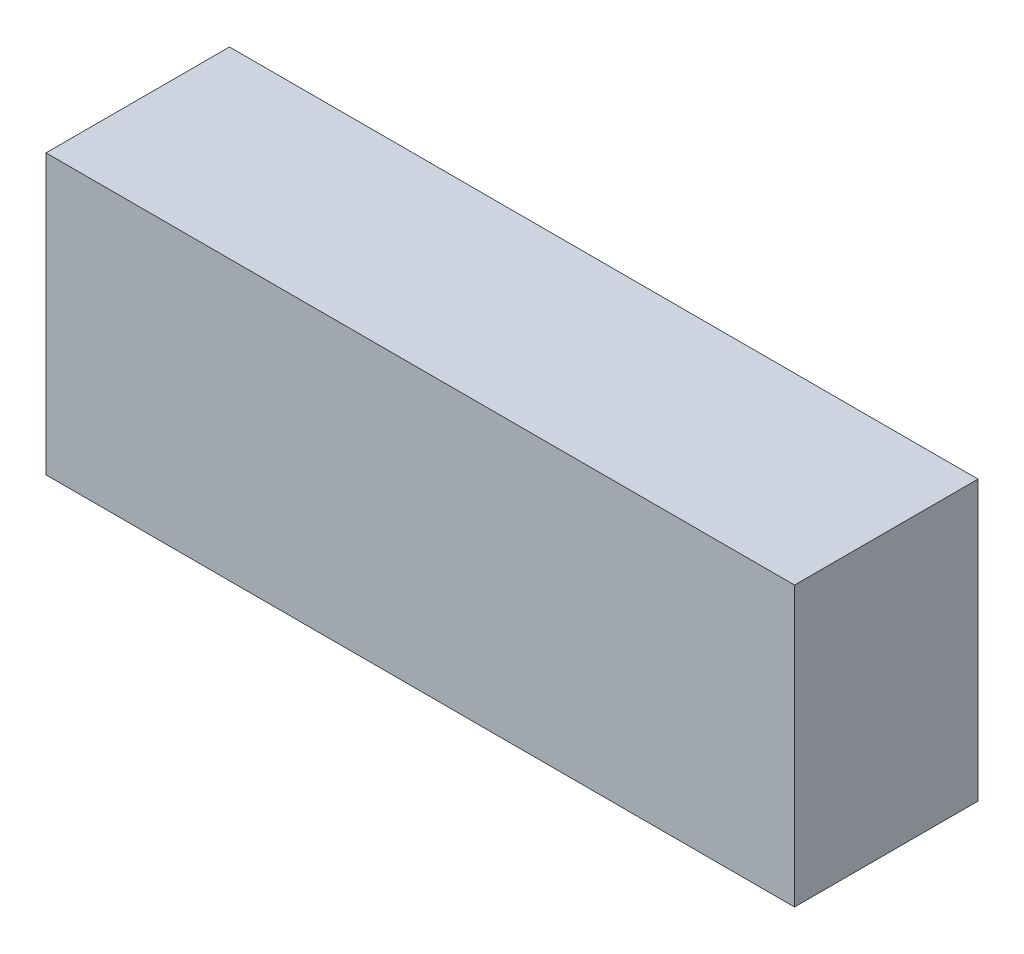
ISO-10303-21;
HEADER;
FILE_DESCRIPTION(('STEP AP214'),'2;1');
FILE_NAME('part.step','',(''),(''),'','','');
FILE_SCHEMA(('AUTOMOTIVE_DESIGN { 1 0 10303 214 1 1 1 1 }'));
ENDSEC;
DATA;
#1=APPLICATION_CONTEXT('core data for automotive mechanical design processes');
#2=APPLICATION_PROTOCOL_DEFINITION('international standard','automotive_design',2000,#1);
#3=PRODUCT_CONTEXT('',#1,'mechanical');
#4=PRODUCT('Part','Part','',(#3));
#5=PRODUCT_RELATED_PRODUCT_CATEGORY('part','',(#4));
#6=PRODUCT_DEFINITION_FORMATION('','',#4);
#7=PRODUCT_DEFINITION_CONTEXT('part definition',#1,'design');
#8=PRODUCT_DEFINITION('design','',#6,#7);
#9=PRODUCT_DEFINITION_SHAPE('','',#8);
#10=(LENGTH_UNIT() NAMED_UNIT(*) SI_UNIT(.MILLI.,.METRE.));
#11=(NAMED_UNIT(*) PLANE_ANGLE_UNIT() SI_UNIT($,.RADIAN.));
#12=(NAMED_UNIT(*) SI_UNIT($,.STERADIAN.) SOLID_ANGLE_UNIT());
#13=UNCERTAINTY_MEASURE_WITH_UNIT(LENGTH_MEASURE(1.E-05),#10,'distance_accuracy_value','');
#14=(GEOMETRIC_REPRESENTATION_CONTEXT(3) GLOBAL_UNCERTAINTY_ASSIGNED_CONTEXT((#13)) GLOBAL_UNIT_ASSIGNED_CONTEXT((#10,
#11,#12)) REPRESENTATION_CONTEXT('',''));
#15=CARTESIAN_POINT('',(0.,0.,0.));
#16=DIRECTION('',(0.,0.,1.));
#17=DIRECTION('',(1.,0.,0.));
#18=AXIS2_PLACEMENT_3D('',#15,#16,#17);
#19=CARTESIAN_POINT('',(0.,0.,25.));
#20=DIRECTION('',(1.,0.,0.));
#21=DIRECTION('',(0.,0.,-1.));
#22=AXIS2_PLACEMENT_3D('',#19,#20,#21);
#23=PLANE('',#22);
#24=CARTESIAN_POINT('',(0.,19.,12.5));
#25=DIRECTION('',(-1.,0.,0.));
#26=DIRECTION('',(0.,0.,1.));
#27=AXIS2_PLACEMENT_3D('',#24,#25,#26);
#28=CIRCLE('',#27,3.);
#29=CARTESIAN_POINT('',(0.,19.,15.5));
#30=VERTEX_POINT('',#29);
#31=EDGE_CURVE('E163',#30,#30,#28,.T.);
#32=ORIENTED_EDGE('',*,*,#31,.F.);
#33=EDGE_LOOP('',(#32));
#34=FACE_BOUND('',#33,.T.);
#35=DIRECTION('',(0.,-1.,0.));
#36=VECTOR('',#35,1.);
#37=CARTESIAN_POINT('',(0.,0.,0.));
#38=LINE('',#37,#36);
#39=CARTESIAN_POINT('',(0.,38.,0.));
#40=VERTEX_POINT('',#39);
#41=CARTESIAN_POINT('',(0.,0.,0.));
#42=VERTEX_POINT('',#41);
#43=EDGE_CURVE('E168',#40,#42,#38,.T.);
#44=ORIENTED_EDGE('',*,*,#43,.T.);
#45=DIRECTION('',(0.,0.,-1.));
#46=VECTOR('',#45,1.);
#47=CARTESIAN_POINT('',(0.,0.,25.));
#48=LINE('',#47,#46);
#49=CARTESIAN_POINT('',(0.,0.,25.));
#50=VERTEX_POINT('',#49);
#51=EDGE_CURVE('E11',#50,#42,#48,.T.);
#52=ORIENTED_EDGE('',*,*,#51,.F.);
#53=DIRECTION('',(0.,-1.,0.));
#54=VECTOR('',#53,1.);
#55=CARTESIAN_POINT('',(0.,0.,25.));
#56=LINE('',#55,#54);
#57=CARTESIAN_POINT('',(0.,38.,25.));
#58=VERTEX_POINT('',#57);
#59=EDGE_CURVE('E172',#58,#50,#56,.T.);
#60=ORIENTED_EDGE('',*,*,#59,.F.);
#61=DIRECTION('',(0.,0.,-1.));
#62=VECTOR('',#61,1.);
#63=CARTESIAN_POINT('',(0.,38.,25.));
#64=LINE('',#63,#62);
#65=EDGE_CURVE('E182',#58,#40,#64,.T.);
#66=ORIENTED_EDGE('',*,*,#65,.T.);
#67=EDGE_LOOP('',(#44,#52,#60,#66));
#68=FACE_BOUND('',#67,.T.);
#69=ADVANCED_FACE('F47',(#34,#68),#23,.F.);
#70=CARTESIAN_POINT('',(0.,0.,25.));
#71=DIRECTION('',(0.,1.,0.));
#72=DIRECTION('',(0.,0.,1.));
#73=AXIS2_PLACEMENT_3D('',#70,#71,#72);
#74=PLANE('',#73);
#75=CARTESIAN_POINT('',(82.,0.,4.));
#76=DIRECTION('',(0.,-1.,0.));
#77=DIRECTION('',(0.,0.,-1.));
#78=AXIS2_PLACEMENT_3D('',#75,#76,#77);
#79=CIRCLE('',#78,2.025);
#80=CARTESIAN_POINT('',(82.,0.,1.975));
#81=VERTEX_POINT('',#80);
#82=EDGE_CURVE('E128',#81,#81,#79,.T.);
#83=ORIENTED_EDGE('',*,*,#82,.F.);
#84=EDGE_LOOP('',(#83));
#85=FACE_BOUND('',#84,.T.);
#86=CARTESIAN_POINT('',(12.,0.,4.));
#87=DIRECTION('',(0.,-1.,0.));
#88=DIRECTION('',(0.,0.,-1.));
#89=AXIS2_PLACEMENT_3D('',#86,#87,#88);
#90=CIRCLE('',#89,2.025);
#91=CARTESIAN_POINT('',(12.,0.,1.975));
#92=VERTEX_POINT('',#91);
#93=EDGE_CURVE('E119',#92,#92,#90,.T.);
#94=ORIENTED_EDGE('',*,*,#93,.F.);
#95=EDGE_LOOP('',(#94));
#96=FACE_BOUND('',#95,.T.);
#97=CARTESIAN_POINT('',(12.,0.,21.));
#98=DIRECTION('',(0.,-1.,0.));
#99=DIRECTION('',(0.,0.,-1.));
#100=AXIS2_PLACEMENT_3D('',#97,#98,#99);
#101=CIRCLE('',#100,2.025);
#102=CARTESIAN_POINT('',(12.,0.,18.975));
#103=VERTEX_POINT('',#102);
#104=EDGE_CURVE('E139',#103,#103,#101,.T.);
#105=ORIENTED_EDGE('',*,*,#104,.F.);
#106=EDGE_LOOP('',(#105));
#107=FACE_BOUND('',#106,.T.);
#108=CARTESIAN_POINT('',(82.,0.,21.));
#109=DIRECTION('',(0.,-1.,0.));
#110=DIRECTION('',(0.,0.,-1.));
#111=AXIS2_PLACEMENT_3D('',#108,#109,#110);
#112=CIRCLE('',#111,2.025);
#113=CARTESIAN_POINT('',(82.,0.,18.975));
#114=VERTEX_POINT('',#113);
#115=EDGE_CURVE('E151',#114,#114,#112,.T.);
#116=ORIENTED_EDGE('',*,*,#115,.F.);
#117=EDGE_LOOP('',(#116));
#118=FACE_BOUND('',#117,.T.);
#119=DIRECTION('',(1.,0.,0.));
#120=VECTOR('',#119,1.);
#121=CARTESIAN_POINT('',(0.,0.,0.));
#122=LINE('',#121,#120);
#123=CARTESIAN_POINT('',(102.,0.,0.));
#124=VERTEX_POINT('',#123);
#125=EDGE_CURVE('E186',#42,#124,#122,.T.);
#126=ORIENTED_EDGE('',*,*,#125,.T.);
#127=DIRECTION('',(0.,0.,-1.));
#128=VECTOR('',#127,1.);
#129=CARTESIAN_POINT('',(102.,0.,25.));
#130=LINE('',#129,#128);
#131=CARTESIAN_POINT('',(102.,0.,25.));
#132=VERTEX_POINT('',#131);
#133=EDGE_CURVE('E56',#132,#124,#130,.T.);
#134=ORIENTED_EDGE('',*,*,#133,.F.);
#135=DIRECTION('',(1.,0.,0.));
#136=VECTOR('',#135,1.);
#137=CARTESIAN_POINT('',(0.,0.,25.));
#138=LINE('',#137,#136);
#139=EDGE_CURVE('E95',#50,#132,#138,.T.);
#140=ORIENTED_EDGE('',*,*,#139,.F.);
#141=ORIENTED_EDGE('',*,*,#51,.T.);
#142=EDGE_LOOP('',(#126,#134,#140,#141));
#143=FACE_BOUND('',#142,.T.);
#144=ADVANCED_FACE('F215',(#85,#96,#107,#118,#143),#74,.F.);
#145=CARTESIAN_POINT('',(102.,0.,25.));
#146=DIRECTION('',(-1.,0.,0.));
#147=DIRECTION('',(0.,0.,1.));
#148=AXIS2_PLACEMENT_3D('',#145,#146,#147);
#149=PLANE('',#148);
#150=DIRECTION('',(0.,1.,0.));
#151=VECTOR('',#150,1.);
#152=CARTESIAN_POINT('',(102.,0.,0.));
#153=LINE('',#152,#151);
#154=CARTESIAN_POINT('',(102.,38.,0.));
#155=VERTEX_POINT('',#154);
#156=EDGE_CURVE('E82',#124,#155,#153,.T.);
#157=ORIENTED_EDGE('',*,*,#156,.T.);
#158=DIRECTION('',(0.,0.,-1.));
#159=VECTOR('',#158,1.);
#160=CARTESIAN_POINT('',(102.,38.,25.));
#161=LINE('',#160,#159);
#162=CARTESIAN_POINT('',(102.,38.,25.));
#163=VERTEX_POINT('',#162);
#164=EDGE_CURVE('E195',#163,#155,#161,.T.);
#165=ORIENTED_EDGE('',*,*,#164,.F.);
#166=DIRECTION('',(0.,1.,0.));
#167=VECTOR('',#166,1.);
#168=CARTESIAN_POINT('',(102.,0.,25.));
#169=LINE('',#168,#167);
#170=EDGE_CURVE('E177',#132,#163,#169,.T.);
#171=ORIENTED_EDGE('',*,*,#170,.F.);
#172=ORIENTED_EDGE('',*,*,#133,.T.);
#173=EDGE_LOOP('',(#157,#165,#171,#172));
#174=FACE_BOUND('',#173,.T.);
#175=ADVANCED_FACE('F199',(#174),#149,.F.);
#176=CARTESIAN_POINT('',(0.,38.,25.));
#177=DIRECTION('',(0.,-1.,0.));
#178=DIRECTION('',(0.,0.,-1.));
#179=AXIS2_PLACEMENT_3D('',#176,#177,#178);
#180=PLANE('',#179);
#181=DIRECTION('',(-1.,0.,0.));
#182=VECTOR('',#181,1.);
#183=CARTESIAN_POINT('',(0.,38.,0.));
#184=LINE('',#183,#182);
#185=EDGE_CURVE('E88',#155,#40,#184,.T.);
#186=ORIENTED_EDGE('',*,*,#185,.T.);
#187=ORIENTED_EDGE('',*,*,#65,.F.);
#188=DIRECTION('',(-1.,0.,0.));
#189=VECTOR('',#188,1.);
#190=CARTESIAN_POINT('',(0.,38.,25.));
#191=LINE('',#190,#189);
#192=EDGE_CURVE('E64',#163,#58,#191,.T.);
#193=ORIENTED_EDGE('',*,*,#192,.F.);
#194=ORIENTED_EDGE('',*,*,#164,.T.);
#195=EDGE_LOOP('',(#186,#187,#193,#194));
#196=FACE_BOUND('',#195,.T.);
#197=ADVANCED_FACE('F206',(#196),#180,.F.);
#198=CARTESIAN_POINT('',(0.,0.,25.));
#199=DIRECTION('',(0.,0.,-1.));
#200=DIRECTION('',(-1.,0.,0.));
#201=AXIS2_PLACEMENT_3D('',#198,#199,#200);
#202=PLANE('',#201);
#203=ORIENTED_EDGE('',*,*,#59,.T.);
#204=ORIENTED_EDGE('',*,*,#139,.T.);
#205=ORIENTED_EDGE('',*,*,#170,.T.);
#206=ORIENTED_EDGE('',*,*,#192,.T.);
#207=EDGE_LOOP('',(#203,#204,#205,#206));
#208=FACE_BOUND('',#207,.T.);
#209=ADVANCED_FACE('F208',(#208),#202,.F.);
#210=CARTESIAN_POINT('',(0.,0.,0.));
#211=DIRECTION('',(0.,0.,-1.));
#212=DIRECTION('',(-1.,0.,0.));
#213=AXIS2_PLACEMENT_3D('',#210,#211,#212);
#214=PLANE('',#213);
#215=ORIENTED_EDGE('',*,*,#43,.F.);
#216=ORIENTED_EDGE('',*,*,#185,.F.);
#217=ORIENTED_EDGE('',*,*,#156,.F.);
#218=ORIENTED_EDGE('',*,*,#125,.F.);
#219=EDGE_LOOP('',(#215,#216,#217,#218));
#220=FACE_BOUND('',#219,.T.);
#221=ADVANCED_FACE('F202',(#220),#214,.T.);
#222=CARTESIAN_POINT('',(60.,19.,12.5));
#223=DIRECTION('',(-1.,0.,0.));
#224=DIRECTION('',(0.,0.,1.));
#225=AXIS2_PLACEMENT_3D('',#222,#223,#224);
#226=CYLINDRICAL_SURFACE('',#225,3.);
#227=CARTESIAN_POINT('',(60.,19.,12.5));
#228=DIRECTION('',(-1.,0.,0.));
#229=DIRECTION('',(0.,0.,1.));
#230=AXIS2_PLACEMENT_3D('',#227,#228,#229);
#231=CIRCLE('',#230,3.);
#232=CARTESIAN_POINT('',(60.,19.,15.5));
#233=VERTEX_POINT('',#232);
#234=EDGE_CURVE('E164',#233,#233,#231,.T.);
#235=ORIENTED_EDGE('',*,*,#234,.F.);
#236=EDGE_LOOP('',(#235));
#237=FACE_BOUND('',#236,.T.);
#238=ORIENTED_EDGE('',*,*,#31,.T.);
#239=EDGE_LOOP('',(#238));
#240=FACE_BOUND('',#239,.T.);
#241=ADVANCED_FACE('F226',(#237,#240),#226,.F.);
#242=CARTESIAN_POINT('',(60.,19.,12.5));
#243=DIRECTION('',(-1.,0.,0.));
#244=DIRECTION('',(0.,0.,1.));
#245=AXIS2_PLACEMENT_3D('',#242,#243,#244);
#246=PLANE('',#245);
#247=ORIENTED_EDGE('',*,*,#234,.T.);
#248=EDGE_LOOP('',(#247));
#249=FACE_BOUND('',#248,.T.);
#250=ADVANCED_FACE('F228',(#249),#246,.T.);
#251=CARTESIAN_POINT('',(82.,8.1,21.));
#252=DIRECTION('',(0.,-1.,0.));
#253=DIRECTION('',(0.,0.,-1.));
#254=AXIS2_PLACEMENT_3D('',#251,#252,#253);
#255=CONICAL_SURFACE('',#254,1.65,1.02974425867665);
#256=CARTESIAN_POINT('',(82.,9.09142002139548,21.));
#257=VERTEX_POINT('',#256);
#258=VERTEX_LOOP('',#257);
#259=FACE_BOUND('',#258,.T.);
#260=CARTESIAN_POINT('',(82.,8.1,21.));
#261=DIRECTION('',(0.,-1.,0.));
#262=DIRECTION('',(0.,0.,-1.));
#263=AXIS2_PLACEMENT_3D('',#260,#261,#262);
#264=CIRCLE('',#263,1.65);
#265=CARTESIAN_POINT('',(82.,8.1,19.35));
#266=VERTEX_POINT('',#265);
#267=EDGE_CURVE('E159',#266,#266,#264,.T.);
#268=ORIENTED_EDGE('',*,*,#267,.T.);
#269=EDGE_LOOP('',(#268));
#270=FACE_BOUND('',#269,.T.);
#271=ADVANCED_FACE('F235',(#259,#270),#255,.F.);
#272=CARTESIAN_POINT('',(82.,0.,21.));
#273=DIRECTION('',(0.,-1.,0.));
#274=DIRECTION('',(0.,0.,-1.));
#275=AXIS2_PLACEMENT_3D('',#272,#273,#274);
#276=CYLINDRICAL_SURFACE('',#275,1.65);
#277=ORIENTED_EDGE('',*,*,#267,.F.);
#278=EDGE_LOOP('',(#277));
#279=FACE_BOUND('',#278,.T.);
#280=CARTESIAN_POINT('',(82.,0.314662361691483,21.));
#281=DIRECTION('',(0.,-1.,0.));
#282=DIRECTION('',(0.,0.,-1.));
#283=AXIS2_PLACEMENT_3D('',#280,#281,#282);
#284=CIRCLE('',#283,1.65);
#285=CARTESIAN_POINT('',(82.,0.314662361691483,19.35));
#286=VERTEX_POINT('',#285);
#287=EDGE_CURVE('E155',#286,#286,#284,.T.);
#288=ORIENTED_EDGE('',*,*,#287,.T.);
#289=EDGE_LOOP('',(#288));
#290=FACE_BOUND('',#289,.T.);
#291=ADVANCED_FACE('F242',(#279,#290),#276,.F.);
#292=CARTESIAN_POINT('',(82.,0.,21.));
#293=DIRECTION('',(0.,-1.,0.));
#294=DIRECTION('',(0.,0.,-1.));
#295=AXIS2_PLACEMENT_3D('',#292,#293,#294);
#296=CONICAL_SURFACE('',#295,2.025,0.872664625997161);
#297=ORIENTED_EDGE('',*,*,#287,.F.);
#298=EDGE_LOOP('',(#297));
#299=FACE_BOUND('',#298,.T.);
#300=ORIENTED_EDGE('',*,*,#115,.T.);
#301=EDGE_LOOP('',(#300));
#302=FACE_BOUND('',#301,.T.);
#303=ADVANCED_FACE('F246',(#299,#302),#296,.F.);
#304=CARTESIAN_POINT('',(12.,8.1,21.));
#305=DIRECTION('',(0.,-1.,0.));
#306=DIRECTION('',(0.,0.,-1.));
#307=AXIS2_PLACEMENT_3D('',#304,#305,#306);
#308=CONICAL_SURFACE('',#307,1.65,1.02974425867665);
#309=CARTESIAN_POINT('',(12.,9.09142002139548,21.));
#310=VERTEX_POINT('',#309);
#311=VERTEX_LOOP('',#310);
#312=FACE_BOUND('',#311,.T.);
#313=CARTESIAN_POINT('',(12.,8.1,21.));
#314=DIRECTION('',(0.,-1.,0.));
#315=DIRECTION('',(0.,0.,-1.));
#316=AXIS2_PLACEMENT_3D('',#313,#314,#315);
#317=CIRCLE('',#316,1.65);
#318=CARTESIAN_POINT('',(12.,8.1,19.35));
#319=VERTEX_POINT('',#318);
#320=EDGE_CURVE('E147',#319,#319,#317,.T.);
#321=ORIENTED_EDGE('',*,*,#320,.T.);
#322=EDGE_LOOP('',(#321));
#323=FACE_BOUND('',#322,.T.);
#324=ADVANCED_FACE('F250',(#312,#323),#308,.F.);
#325=CARTESIAN_POINT('',(12.,0.,21.));
#326=DIRECTION('',(0.,-1.,0.));
#327=DIRECTION('',(0.,0.,-1.));
#328=AXIS2_PLACEMENT_3D('',#325,#326,#327);
#329=CYLINDRICAL_SURFACE('',#328,1.65);
#330=ORIENTED_EDGE('',*,*,#320,.F.);
#331=EDGE_LOOP('',(#330));
#332=FACE_BOUND('',#331,.T.);
#333=CARTESIAN_POINT('',(12.,0.314662361691483,21.));
#334=DIRECTION('',(0.,-1.,0.));
#335=DIRECTION('',(0.,0.,-1.));
#336=AXIS2_PLACEMENT_3D('',#333,#334,#335);
#337=CIRCLE('',#336,1.65);
#338=CARTESIAN_POINT('',(12.,0.314662361691483,19.35));
#339=VERTEX_POINT('',#338);
#340=EDGE_CURVE('E143',#339,#339,#337,.T.);
#341=ORIENTED_EDGE('',*,*,#340,.T.);
#342=EDGE_LOOP('',(#341));
#343=FACE_BOUND('',#342,.T.);
#344=ADVANCED_FACE('F254',(#332,#343),#329,.F.);
#345=CARTESIAN_POINT('',(12.,0.,21.));
#346=DIRECTION('',(0.,-1.,0.));
#347=DIRECTION('',(0.,0.,-1.));
#348=AXIS2_PLACEMENT_3D('',#345,#346,#347);
#349=CONICAL_SURFACE('',#348,2.025,0.872664625997161);
#350=ORIENTED_EDGE('',*,*,#340,.F.);
#351=EDGE_LOOP('',(#350));
#352=FACE_BOUND('',#351,.T.);
#353=ORIENTED_EDGE('',*,*,#104,.T.);
#354=EDGE_LOOP('',(#353));
#355=FACE_BOUND('',#354,.T.);
#356=ADVANCED_FACE('F258',(#352,#355),#349,.F.);
#357=CARTESIAN_POINT('',(12.,8.1,4.));
#358=DIRECTION('',(0.,-1.,0.));
#359=DIRECTION('',(0.,0.,-1.));
#360=AXIS2_PLACEMENT_3D('',#357,#358,#359);
#361=CONICAL_SURFACE('',#360,1.65,1.02974425867665);
#362=CARTESIAN_POINT('',(12.,9.09142002139548,4.));
#363=VERTEX_POINT('',#362);
#364=VERTEX_LOOP('',#363);
#365=FACE_BOUND('',#364,.T.);
#366=CARTESIAN_POINT('',(12.,8.1,4.));
#367=DIRECTION('',(0.,-1.,0.));
#368=DIRECTION('',(0.,0.,-1.));
#369=AXIS2_PLACEMENT_3D('',#366,#367,#368);
#370=CIRCLE('',#369,1.65);
#371=CARTESIAN_POINT('',(12.,8.1,2.35000000000001));
#372=VERTEX_POINT('',#371);
#373=EDGE_CURVE('E135',#372,#372,#370,.T.);
#374=ORIENTED_EDGE('',*,*,#373,.T.);
#375=EDGE_LOOP('',(#374));
#376=FACE_BOUND('',#375,.T.);
#377=ADVANCED_FACE('F262',(#365,#376),#361,.F.);
#378=CARTESIAN_POINT('',(12.,0.,4.));
#379=DIRECTION('',(0.,-1.,0.));
#380=DIRECTION('',(0.,0.,-1.));
#381=AXIS2_PLACEMENT_3D('',#378,#379,#380);
#382=CYLINDRICAL_SURFACE('',#381,1.65);
#383=ORIENTED_EDGE('',*,*,#373,.F.);
#384=EDGE_LOOP('',(#383));
#385=FACE_BOUND('',#384,.T.);
#386=CARTESIAN_POINT('',(12.,0.314662361691483,4.));
#387=DIRECTION('',(0.,-1.,0.));
#388=DIRECTION('',(0.,0.,-1.));
#389=AXIS2_PLACEMENT_3D('',#386,#387,#388);
#390=CIRCLE('',#389,1.65);
#391=CARTESIAN_POINT('',(12.,0.314662361691483,2.35));
#392=VERTEX_POINT('',#391);
#393=EDGE_CURVE('E125',#392,#392,#390,.T.);
#394=ORIENTED_EDGE('',*,*,#393,.T.);
#395=EDGE_LOOP('',(#394));
#396=FACE_BOUND('',#395,.T.);
#397=ADVANCED_FACE('F266',(#385,#396),#382,.F.);
#398=CARTESIAN_POINT('',(12.,0.,4.));
#399=DIRECTION('',(0.,-1.,0.));
#400=DIRECTION('',(0.,0.,-1.));
#401=AXIS2_PLACEMENT_3D('',#398,#399,#400);
#402=CONICAL_SURFACE('',#401,2.025,0.872664625997161);
#403=ORIENTED_EDGE('',*,*,#393,.F.);
#404=EDGE_LOOP('',(#403));
#405=FACE_BOUND('',#404,.T.);
#406=ORIENTED_EDGE('',*,*,#93,.T.);
#407=EDGE_LOOP('',(#406));
#408=FACE_BOUND('',#407,.T.);
#409=ADVANCED_FACE('F112',(#405,#408),#402,.F.);
#410=CARTESIAN_POINT('',(82.,8.1,4.));
#411=DIRECTION('',(0.,-1.,0.));
#412=DIRECTION('',(0.,0.,-1.));
#413=AXIS2_PLACEMENT_3D('',#410,#411,#412);
#414=CONICAL_SURFACE('',#413,1.65,1.02974425867665);
#415=CARTESIAN_POINT('',(82.,9.09142002139548,4.));
#416=VERTEX_POINT('',#415);
#417=VERTEX_LOOP('',#416);
#418=FACE_BOUND('',#417,.T.);
#419=CARTESIAN_POINT('',(82.,8.1,4.));
#420=DIRECTION('',(0.,-1.,0.));
#421=DIRECTION('',(0.,0.,-1.));
#422=AXIS2_PLACEMENT_3D('',#419,#420,#421);
#423=CIRCLE('',#422,1.65);
#424=CARTESIAN_POINT('',(82.,8.1,2.35));
#425=VERTEX_POINT('',#424);
#426=EDGE_CURVE('E116',#425,#425,#423,.T.);
#427=ORIENTED_EDGE('',*,*,#426,.T.);
#428=EDGE_LOOP('',(#427));
#429=FACE_BOUND('',#428,.T.);
#430=ADVANCED_FACE('F108',(#418,#429),#414,.F.);
#431=CARTESIAN_POINT('',(82.,0.,4.));
#432=DIRECTION('',(0.,-1.,0.));
#433=DIRECTION('',(0.,0.,-1.));
#434=AXIS2_PLACEMENT_3D('',#431,#432,#433);
#435=CYLINDRICAL_SURFACE('',#434,1.65);
#436=ORIENTED_EDGE('',*,*,#426,.F.);
#437=EDGE_LOOP('',(#436));
#438=FACE_BOUND('',#437,.T.);
#439=CARTESIAN_POINT('',(82.,0.314662361691483,4.));
#440=DIRECTION('',(0.,-1.,0.));
#441=DIRECTION('',(0.,0.,-1.));
#442=AXIS2_PLACEMENT_3D('',#439,#440,#441);
#443=CIRCLE('',#442,1.65);
#444=CARTESIAN_POINT('',(82.,0.314662361691483,2.35));
#445=VERTEX_POINT('',#444);
#446=EDGE_CURVE('E120',#445,#445,#443,.T.);
#447=ORIENTED_EDGE('',*,*,#446,.T.);
#448=EDGE_LOOP('',(#447));
#449=FACE_BOUND('',#448,.T.);
#450=ADVANCED_FACE('F111',(#438,#449),#435,.F.);
#451=CARTESIAN_POINT('',(82.,0.,4.));
#452=DIRECTION('',(0.,-1.,0.));
#453=DIRECTION('',(0.,0.,-1.));
#454=AXIS2_PLACEMENT_3D('',#451,#452,#453);
#455=CONICAL_SURFACE('',#454,2.025,0.872664625997161);
#456=ORIENTED_EDGE('',*,*,#446,.F.);
#457=EDGE_LOOP('',(#456));
#458=FACE_BOUND('',#457,.T.);
#459=ORIENTED_EDGE('',*,*,#82,.T.);
#460=EDGE_LOOP('',(#459));
#461=FACE_BOUND('',#460,.T.);
#462=ADVANCED_FACE('F276',(#458,#461),#455,.F.);
#463=CLOSED_SHELL('',(#69,#144,#175,#197,#209,#221,#241,#250,#271,#291,#303,#324,#344,#356,#377,
#397,#409,#430,#450,#462));
#464=MANIFOLD_SOLID_BREP('B2',#463);
#465=ADVANCED_BREP_SHAPE_REPRESENTATION('',(#18,#464),#14);
#466=SHAPE_DEFINITION_REPRESENTATION(#9,#465);
ENDSEC;
END-ISO-10303-21;
